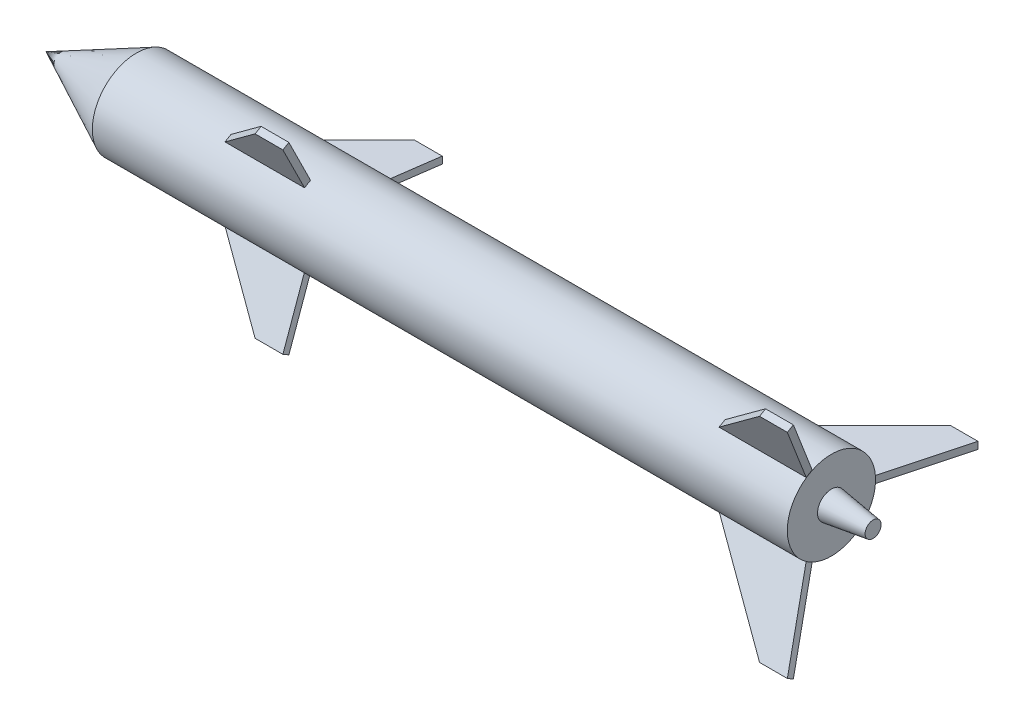
ISO-10303-21;
HEADER;
FILE_DESCRIPTION(('STEP AP214'),'2;1');
FILE_NAME('part.step','',(''),(''),'','','');
FILE_SCHEMA(('AUTOMOTIVE_DESIGN { 1 0 10303 214 1 1 1 1 }'));
ENDSEC;
DATA;
#1=APPLICATION_CONTEXT('core data for automotive mechanical design processes');
#2=APPLICATION_PROTOCOL_DEFINITION('international standard','automotive_design',2000,#1);
#3=PRODUCT_CONTEXT('',#1,'mechanical');
#4=PRODUCT('Part','Part','',(#3));
#5=PRODUCT_RELATED_PRODUCT_CATEGORY('part','',(#4));
#6=PRODUCT_DEFINITION_FORMATION('','',#4);
#7=PRODUCT_DEFINITION_CONTEXT('part definition',#1,'design');
#8=PRODUCT_DEFINITION('design','',#6,#7);
#9=PRODUCT_DEFINITION_SHAPE('','',#8);
#10=(LENGTH_UNIT() NAMED_UNIT(*) SI_UNIT(.MILLI.,.METRE.));
#11=(NAMED_UNIT(*) PLANE_ANGLE_UNIT() SI_UNIT($,.RADIAN.));
#12=(NAMED_UNIT(*) SI_UNIT($,.STERADIAN.) SOLID_ANGLE_UNIT());
#13=UNCERTAINTY_MEASURE_WITH_UNIT(LENGTH_MEASURE(1.E-05),#10,'distance_accuracy_value','');
#14=(GEOMETRIC_REPRESENTATION_CONTEXT(3) GLOBAL_UNCERTAINTY_ASSIGNED_CONTEXT((#13)) GLOBAL_UNIT_ASSIGNED_CONTEXT((#10,
#11,#12)) REPRESENTATION_CONTEXT('',''));
#15=CARTESIAN_POINT('',(0.,0.,0.));
#16=DIRECTION('',(0.,0.,1.));
#17=DIRECTION('',(1.,0.,0.));
#18=AXIS2_PLACEMENT_3D('',#15,#16,#17);
#19=CARTESIAN_POINT('',(226.038858788057,12.7,0.));
#20=DIRECTION('',(-1.,0.,0.));
#21=DIRECTION('',(0.,0.,1.));
#22=AXIS2_PLACEMENT_3D('',#19,#20,#21);
#23=PLANE('',#22);
#24=CARTESIAN_POINT('',(226.038858788057,0.,0.));
#25=DIRECTION('',(-1.,0.,0.));
#26=DIRECTION('',(0.,0.,1.));
#27=AXIS2_PLACEMENT_3D('',#24,#25,#26);
#28=CIRCLE('',#27,12.7);
#29=CARTESIAN_POINT('',(226.038858788057,0.,12.7));
#30=VERTEX_POINT('',#29);
#31=EDGE_CURVE('E445',#30,#30,#28,.T.);
#32=ORIENTED_EDGE('',*,*,#31,.F.);
#33=EDGE_LOOP('',(#32));
#34=FACE_BOUND('',#33,.T.);
#35=CARTESIAN_POINT('',(226.038858788057,0.,0.));
#36=DIRECTION('',(-1.,0.,0.));
#37=DIRECTION('',(0.,0.,1.));
#38=AXIS2_PLACEMENT_3D('',#35,#36,#37);
#39=CIRCLE('',#38,4.);
#40=CARTESIAN_POINT('',(226.038858788057,0.,4.));
#41=VERTEX_POINT('',#40);
#42=EDGE_CURVE('E11',#41,#41,#39,.F.);
#43=ORIENTED_EDGE('',*,*,#42,.F.);
#44=EDGE_LOOP('',(#43));
#45=FACE_BOUND('',#44,.T.);
#46=ADVANCED_FACE('F39',(#34,#45),#23,.F.);
#47=CARTESIAN_POINT('',(-90.3495091606731,0.,0.));
#48=DIRECTION('',(-1.,0.,0.));
#49=DIRECTION('',(0.,0.,1.));
#50=AXIS2_PLACEMENT_3D('',#47,#48,#49);
#51=CYLINDRICAL_SURFACE('',#50,12.7);
#52=CARTESIAN_POINT('',(46.038858788057,0.,0.));
#53=DIRECTION('',(0.707106781186546,0.612372435695794,-0.353553390593277));
#54=DIRECTION('',(-0.707106781186549,0.612372435695792,-0.353553390593276));
#55=AXIS2_PLACEMENT_3D('',#52,#53,#54);
#56=ELLIPSE('',#55,17.9605122421383,12.7);
#57=CARTESIAN_POINT('',(58.6994274956626,-10.4643741271447,7.19630975758725));
#58=VERTEX_POINT('',#57);
#59=CARTESIAN_POINT('',(58.6994274956626,-11.4643741271447,5.46425895001838));
#60=VERTEX_POINT('',#59);
#61=EDGE_CURVE('E293',#58,#60,#56,.T.);
#62=ORIENTED_EDGE('',*,*,#61,.F.);
#63=DIRECTION('',(-1.,0.,0.));
#64=VECTOR('',#63,1.);
#65=CARTESIAN_POINT('',(-90.3495091606731,-10.4643741271447,7.19630975758725));
#66=LINE('',#65,#64);
#67=CARTESIAN_POINT('',(81.6019606409593,-10.4643741271447,7.19630975758725));
#68=VERTEX_POINT('',#67);
#69=EDGE_CURVE('E254',#58,#68,#66,.F.);
#70=ORIENTED_EDGE('',*,*,#69,.T.);
#71=CARTESIAN_POINT('',(79.8226337469855,0.,0.));
#72=DIRECTION('',(-0.990268068741571,-0.120527440954867,0.0695865504800298));
#73=DIRECTION('',(-0.139173100960058,0.857597304086753,-0.49513403437079));
#74=AXIS2_PLACEMENT_3D('',#71,#72,#73);
#75=ELLIPSE('',#74,12.8248101709864,12.7);
#76=CARTESIAN_POINT('',(81.6019606409593,-11.4643741271447,5.46425895001837));
#77=VERTEX_POINT('',#76);
#78=EDGE_CURVE('E63',#77,#68,#75,.T.);
#79=ORIENTED_EDGE('',*,*,#78,.F.);
#80=DIRECTION('',(-1.,0.,0.));
#81=VECTOR('',#80,1.);
#82=CARTESIAN_POINT('',(-90.3495091606731,-11.4643741271447,5.46425895001837));
#83=LINE('',#82,#81);
#84=EDGE_CURVE('E289',#60,#77,#83,.F.);
#85=ORIENTED_EDGE('',*,*,#84,.F.);
#86=EDGE_LOOP('',(#62,#70,#79,#85));
#87=FACE_BOUND('',#86,.T.);
#88=CARTESIAN_POINT('',(222.578858788057,0.,0.));
#89=DIRECTION('',(-0.965925826289068,-0.224143868042013,0.129409522551262));
#90=DIRECTION('',(-0.258819045102521,0.836516303737806,-0.482962913144538));
#91=AXIS2_PLACEMENT_3D('',#88,#89,#90);
#92=ELLIPSE('',#91,13.1480074912081,12.7);
#93=CARTESIAN_POINT('',(225.971247948979,-11.4643741271447,5.46425895001837));
#94=VERTEX_POINT('',#93);
#95=CARTESIAN_POINT('',(225.971247948979,-10.4643741271447,7.19630975758725));
#96=VERTEX_POINT('',#95);
#97=EDGE_CURVE('E385',#94,#96,#92,.T.);
#98=ORIENTED_EDGE('',*,*,#97,.F.);
#99=DIRECTION('',(-1.,0.,0.));
#100=VECTOR('',#99,1.);
#101=CARTESIAN_POINT('',(-90.3495091606731,-11.4643741271447,5.46425895001837));
#102=LINE('',#101,#100);
#103=CARTESIAN_POINT('',(200.885598423183,-11.4643741271447,5.46425895001838));
#104=VERTEX_POINT('',#103);
#105=EDGE_CURVE('E378',#94,#104,#102,.T.);
#106=ORIENTED_EDGE('',*,*,#105,.T.);
#107=CARTESIAN_POINT('',(188.225029715578,0.,0.));
#108=DIRECTION('',(0.707106781186552,0.612372435695789,-0.353553390593275));
#109=DIRECTION('',(-0.707106781186543,0.612372435695796,-0.353553390593279));
#110=AXIS2_PLACEMENT_3D('',#107,#108,#109);
#111=ELLIPSE('',#110,17.9605122421382,12.7);
#112=CARTESIAN_POINT('',(200.885598423183,-10.4643741271447,7.19630975758725));
#113=VERTEX_POINT('',#112);
#114=EDGE_CURVE('E370',#113,#104,#111,.T.);
#115=ORIENTED_EDGE('',*,*,#114,.F.);
#116=DIRECTION('',(-1.,0.,0.));
#117=VECTOR('',#116,1.);
#118=CARTESIAN_POINT('',(-90.3495091606731,-10.4643741271447,7.19630975758725));
#119=LINE('',#118,#117);
#120=EDGE_CURVE('E343',#96,#113,#119,.T.);
#121=ORIENTED_EDGE('',*,*,#120,.F.);
#122=EDGE_LOOP('',(#98,#106,#115,#121));
#123=FACE_BOUND('',#122,.T.);
#124=ORIENTED_EDGE('',*,*,#31,.T.);
#125=EDGE_LOOP('',(#124));
#126=FACE_BOUND('',#125,.T.);
#127=CARTESIAN_POINT('',(26.038858788057,0.,0.));
#128=DIRECTION('',(-1.,0.,0.));
#129=DIRECTION('',(0.,0.,1.));
#130=AXIS2_PLACEMENT_3D('',#127,#128,#129);
#131=CIRCLE('',#130,12.7);
#132=CARTESIAN_POINT('',(26.038858788057,0.,12.7));
#133=VERTEX_POINT('',#132);
#134=EDGE_CURVE('E449',#133,#133,#131,.T.);
#135=ORIENTED_EDGE('',*,*,#134,.F.);
#136=EDGE_LOOP('',(#135));
#137=FACE_BOUND('',#136,.T.);
#138=CARTESIAN_POINT('',(222.578858788057,0.,0.));
#139=DIRECTION('',(-0.965925826289068,0.,-0.258819045102521));
#140=DIRECTION('',(-0.258819045102521,0.,0.965925826289068));
#141=AXIS2_PLACEMENT_3D('',#138,#139,#140);
#142=ELLIPSE('',#141,13.1480074912081,12.7);
#143=CARTESIAN_POINT('',(225.971247948979,1.,-12.6605687076055));
#144=VERTEX_POINT('',#143);
#145=CARTESIAN_POINT('',(225.971247948979,-1.,-12.6605687076055));
#146=VERTEX_POINT('',#145);
#147=EDGE_CURVE('E461',#144,#146,#142,.T.);
#148=ORIENTED_EDGE('',*,*,#147,.F.);
#149=DIRECTION('',(-1.,0.,0.));
#150=VECTOR('',#149,1.);
#151=CARTESIAN_POINT('',(-90.3495091606731,1.,-12.6605687076055));
#152=LINE('',#151,#150);
#153=CARTESIAN_POINT('',(200.885598423183,1.,-12.6605687076055));
#154=VERTEX_POINT('',#153);
#155=EDGE_CURVE('E465',#144,#154,#152,.T.);
#156=ORIENTED_EDGE('',*,*,#155,.T.);
#157=CARTESIAN_POINT('',(188.225029715578,0.,0.));
#158=DIRECTION('',(0.707106781186552,0.,0.707106781186543));
#159=DIRECTION('',(-0.707106781186543,0.,0.707106781186552));
#160=AXIS2_PLACEMENT_3D('',#157,#158,#159);
#161=ELLIPSE('',#160,17.9605122421382,12.7);
#162=CARTESIAN_POINT('',(200.885598423183,-1.,-12.6605687076055));
#163=VERTEX_POINT('',#162);
#164=EDGE_CURVE('E457',#163,#154,#161,.T.);
#165=ORIENTED_EDGE('',*,*,#164,.F.);
#166=DIRECTION('',(-1.,0.,0.));
#167=VECTOR('',#166,1.);
#168=CARTESIAN_POINT('',(-90.3495091606731,-1.,-12.6605687076055));
#169=LINE('',#168,#167);
#170=EDGE_CURVE('E453',#146,#163,#169,.T.);
#171=ORIENTED_EDGE('',*,*,#170,.F.);
#172=EDGE_LOOP('',(#148,#156,#165,#171));
#173=FACE_BOUND('',#172,.T.);
#174=DIRECTION('',(-1.,0.,0.));
#175=VECTOR('',#174,1.);
#176=CARTESIAN_POINT('',(-90.3495091606731,1.,-12.6605687076055));
#177=LINE('',#176,#175);
#178=CARTESIAN_POINT('',(58.6994274956626,1.,-12.6605687076055));
#179=VERTEX_POINT('',#178);
#180=CARTESIAN_POINT('',(81.6019606409593,1.,-12.6605687076055));
#181=VERTEX_POINT('',#180);
#182=EDGE_CURVE('E48',#179,#181,#177,.F.);
#183=ORIENTED_EDGE('',*,*,#182,.F.);
#184=CARTESIAN_POINT('',(46.038858788057,0.,0.));
#185=DIRECTION('',(0.707106781186546,0.,0.707106781186549));
#186=DIRECTION('',(-0.707106781186549,0.,0.707106781186546));
#187=AXIS2_PLACEMENT_3D('',#184,#185,#186);
#188=ELLIPSE('',#187,17.9605122421383,12.7);
#189=CARTESIAN_POINT('',(58.6994274956626,-1.,-12.6605687076055));
#190=VERTEX_POINT('',#189);
#191=EDGE_CURVE('E476',#190,#179,#188,.T.);
#192=ORIENTED_EDGE('',*,*,#191,.F.);
#193=DIRECTION('',(-1.,0.,0.));
#194=VECTOR('',#193,1.);
#195=CARTESIAN_POINT('',(-90.3495091606731,-1.,-12.6605687076055));
#196=LINE('',#195,#194);
#197=CARTESIAN_POINT('',(81.6019606409593,-1.,-12.6605687076055));
#198=VERTEX_POINT('',#197);
#199=EDGE_CURVE('E468',#190,#198,#196,.F.);
#200=ORIENTED_EDGE('',*,*,#199,.T.);
#201=CARTESIAN_POINT('',(79.8226337469855,0.,0.));
#202=DIRECTION('',(-0.990268068741571,0.,-0.139173100960058));
#203=DIRECTION('',(-0.139173100960058,0.,0.990268068741571));
#204=AXIS2_PLACEMENT_3D('',#201,#202,#203);
#205=ELLIPSE('',#204,12.8248101709864,12.7);
#206=EDGE_CURVE('E472',#181,#198,#205,.T.);
#207=ORIENTED_EDGE('',*,*,#206,.F.);
#208=EDGE_LOOP('',(#183,#192,#200,#207));
#209=FACE_BOUND('',#208,.T.);
#210=CARTESIAN_POINT('',(222.578858788057,0.,0.));
#211=DIRECTION('',(-0.965925826289068,0.224143868042015,0.129409522551258));
#212=DIRECTION('',(-0.258819045102521,-0.836516303737812,-0.482962913144526));
#213=AXIS2_PLACEMENT_3D('',#210,#211,#212);
#214=ELLIPSE('',#213,13.1480074912081,12.7);
#215=CARTESIAN_POINT('',(225.971247948979,10.4643741271448,7.1963097575871));
#216=VERTEX_POINT('',#215);
#217=CARTESIAN_POINT('',(225.971247948979,11.4643741271447,5.46425895001821));
#218=VERTEX_POINT('',#217);
#219=EDGE_CURVE('E339',#216,#218,#214,.T.);
#220=ORIENTED_EDGE('',*,*,#219,.F.);
#221=DIRECTION('',(-1.,0.,0.));
#222=VECTOR('',#221,1.);
#223=CARTESIAN_POINT('',(-90.3495091606731,10.4643741271448,7.1963097575871));
#224=LINE('',#223,#222);
#225=CARTESIAN_POINT('',(200.885598423183,10.4643741271448,7.1963097575871));
#226=VERTEX_POINT('',#225);
#227=EDGE_CURVE('E332',#216,#226,#224,.T.);
#228=ORIENTED_EDGE('',*,*,#227,.T.);
#229=CARTESIAN_POINT('',(188.225029715578,0.,0.));
#230=DIRECTION('',(0.707106781186552,-0.612372435695794,-0.353553390593266));
#231=DIRECTION('',(-0.707106781186543,-0.612372435695801,-0.35355339059327));
#232=AXIS2_PLACEMENT_3D('',#229,#230,#231);
#233=ELLIPSE('',#232,17.9605122421382,12.7);
#234=CARTESIAN_POINT('',(200.885598423183,11.4643741271447,5.46425895001821));
#235=VERTEX_POINT('',#234);
#236=EDGE_CURVE('E324',#235,#226,#233,.T.);
#237=ORIENTED_EDGE('',*,*,#236,.F.);
#238=DIRECTION('',(-1.,0.,0.));
#239=VECTOR('',#238,1.);
#240=CARTESIAN_POINT('',(-90.3495091606731,11.4643741271447,5.46425895001821));
#241=LINE('',#240,#239);
#242=EDGE_CURVE('E297',#218,#235,#241,.T.);
#243=ORIENTED_EDGE('',*,*,#242,.F.);
#244=EDGE_LOOP('',(#220,#228,#237,#243));
#245=FACE_BOUND('',#244,.T.);
#246=CARTESIAN_POINT('',(46.038858788057,0.,0.));
#247=DIRECTION('',(0.707106781186546,-0.612372435695799,-0.353553390593269));
#248=DIRECTION('',(-0.707106781186549,-0.612372435695797,-0.353553390593267));
#249=AXIS2_PLACEMENT_3D('',#246,#247,#248);
#250=ELLIPSE('',#249,17.9605122421383,12.7);
#251=CARTESIAN_POINT('',(58.6994274956626,11.4643741271447,5.46425895001821));
#252=VERTEX_POINT('',#251);
#253=CARTESIAN_POINT('',(58.6994274956626,10.4643741271448,7.1963097575871));
#254=VERTEX_POINT('',#253);
#255=EDGE_CURVE('E251',#252,#254,#250,.T.);
#256=ORIENTED_EDGE('',*,*,#255,.F.);
#257=DIRECTION('',(-1.,0.,0.));
#258=VECTOR('',#257,1.);
#259=CARTESIAN_POINT('',(-90.3495091606731,11.4643741271447,5.46425895001821));
#260=LINE('',#259,#258);
#261=CARTESIAN_POINT('',(81.6019606409593,11.4643741271447,5.46425895001821));
#262=VERTEX_POINT('',#261);
#263=EDGE_CURVE('E215',#252,#262,#260,.F.);
#264=ORIENTED_EDGE('',*,*,#263,.T.);
#265=CARTESIAN_POINT('',(79.8226337469855,0.,0.));
#266=DIRECTION('',(-0.990268068741571,0.120527440954868,0.0695865504800281));
#267=DIRECTION('',(-0.139173100960058,-0.85759730408676,-0.495134034370778));
#268=AXIS2_PLACEMENT_3D('',#265,#266,#267);
#269=ELLIPSE('',#268,12.8248101709864,12.7);
#270=CARTESIAN_POINT('',(81.6019606409593,10.4643741271448,7.1963097575871));
#271=VERTEX_POINT('',#270);
#272=EDGE_CURVE('E55',#271,#262,#269,.T.);
#273=ORIENTED_EDGE('',*,*,#272,.F.);
#274=DIRECTION('',(-1.,0.,0.));
#275=VECTOR('',#274,1.);
#276=CARTESIAN_POINT('',(-90.3495091606731,10.4643741271448,7.1963097575871));
#277=LINE('',#276,#275);
#278=EDGE_CURVE('E247',#254,#271,#277,.F.);
#279=ORIENTED_EDGE('',*,*,#278,.F.);
#280=EDGE_LOOP('',(#256,#264,#273,#279));
#281=FACE_BOUND('',#280,.T.);
#282=ADVANCED_FACE('F491',(#87,#123,#126,#137,#173,#209,#245,#281),#51,.T.);
#283=CARTESIAN_POINT('',(26.038858788057,0.,0.));
#284=DIRECTION('',(1.,0.,0.));
#285=DIRECTION('',(0.,0.,-1.));
#286=AXIS2_PLACEMENT_3D('',#283,#284,#285);
#287=CONICAL_SURFACE('',#286,12.7,0.453785605518527);
#288=CARTESIAN_POINT('',(0.,0.,0.));
#289=VERTEX_POINT('',#288);
#290=VERTEX_LOOP('',#289);
#291=FACE_BOUND('',#290,.T.);
#292=ORIENTED_EDGE('',*,*,#134,.T.);
#293=EDGE_LOOP('',(#292));
#294=FACE_BOUND('',#293,.T.);
#295=ADVANCED_FACE('F41',(#291,#294),#287,.T.);
#296=CARTESIAN_POINT('',(222.578858788057,1.,0.));
#297=DIRECTION('',(-0.965925826289068,0.,-0.258819045102521));
#298=DIRECTION('',(-0.258819045102521,0.,0.965925826289068));
#299=AXIS2_PLACEMENT_3D('',#296,#297,#298);
#300=PLANE('',#299);
#301=DIRECTION('',(0.258819045102521,0.,-0.965925826289068));
#302=VECTOR('',#301,1.);
#303=CARTESIAN_POINT('',(222.578858788057,1.,0.));
#304=LINE('',#303,#302);
#305=CARTESIAN_POINT('',(232.225029715577,1.,-36.));
#306=VERTEX_POINT('',#305);
#307=EDGE_CURVE('E418',#144,#306,#304,.T.);
#308=ORIENTED_EDGE('',*,*,#307,.F.);
#309=ORIENTED_EDGE('',*,*,#147,.T.);
#310=DIRECTION('',(0.258819045102521,0.,-0.965925826289068));
#311=VECTOR('',#310,1.);
#312=CARTESIAN_POINT('',(222.578858788057,-1.,0.));
#313=LINE('',#312,#311);
#314=CARTESIAN_POINT('',(232.225029715577,-1.,-36.));
#315=VERTEX_POINT('',#314);
#316=EDGE_CURVE('E417',#146,#315,#313,.T.);
#317=ORIENTED_EDGE('',*,*,#316,.T.);
#318=DIRECTION('',(0.,-1.,0.));
#319=VECTOR('',#318,1.);
#320=CARTESIAN_POINT('',(232.225029715577,1.,-36.));
#321=LINE('',#320,#319);
#322=EDGE_CURVE('E441',#306,#315,#321,.T.);
#323=ORIENTED_EDGE('',*,*,#322,.F.);
#324=EDGE_LOOP('',(#308,#309,#317,#323));
#325=FACE_BOUND('',#324,.T.);
#326=ADVANCED_FACE('F524',(#325),#300,.F.);
#327=CARTESIAN_POINT('',(224.225029715577,1.,-36.));
#328=DIRECTION('',(0.707106781186552,0.,0.707106781186543));
#329=DIRECTION('',(0.707106781186543,0.,-0.707106781186552));
#330=AXIS2_PLACEMENT_3D('',#327,#328,#329);
#331=PLANE('',#330);
#332=DIRECTION('',(-0.707106781186543,0.,0.707106781186551));
#333=VECTOR('',#332,1.);
#334=CARTESIAN_POINT('',(224.225029715577,-1.,-36.));
#335=LINE('',#334,#333);
#336=CARTESIAN_POINT('',(224.225029715577,-1.,-36.));
#337=VERTEX_POINT('',#336);
#338=EDGE_CURVE('E422',#337,#163,#335,.T.);
#339=ORIENTED_EDGE('',*,*,#338,.T.);
#340=ORIENTED_EDGE('',*,*,#164,.T.);
#341=DIRECTION('',(-0.707106781186543,0.,0.707106781186551));
#342=VECTOR('',#341,1.);
#343=CARTESIAN_POINT('',(224.225029715577,1.,-36.));
#344=LINE('',#343,#342);
#345=CARTESIAN_POINT('',(224.225029715577,1.,-36.));
#346=VERTEX_POINT('',#345);
#347=EDGE_CURVE('E425',#346,#154,#344,.T.);
#348=ORIENTED_EDGE('',*,*,#347,.F.);
#349=DIRECTION('',(0.,-1.,0.));
#350=VECTOR('',#349,1.);
#351=CARTESIAN_POINT('',(224.225029715577,1.,-36.));
#352=LINE('',#351,#350);
#353=EDGE_CURVE('E429',#346,#337,#352,.T.);
#354=ORIENTED_EDGE('',*,*,#353,.T.);
#355=EDGE_LOOP('',(#339,#340,#348,#354));
#356=FACE_BOUND('',#355,.T.);
#357=ADVANCED_FACE('F527',(#356),#331,.F.);
#358=CARTESIAN_POINT('',(222.578858788057,1.,0.));
#359=DIRECTION('',(0.,1.,0.));
#360=DIRECTION('',(0.,0.,1.));
#361=AXIS2_PLACEMENT_3D('',#358,#359,#360);
#362=PLANE('',#361);
#363=ORIENTED_EDGE('',*,*,#155,.F.);
#364=ORIENTED_EDGE('',*,*,#307,.T.);
#365=DIRECTION('',(-1.,0.,0.));
#366=VECTOR('',#365,1.);
#367=CARTESIAN_POINT('',(232.225029715577,1.,-36.));
#368=LINE('',#367,#366);
#369=EDGE_CURVE('E421',#306,#346,#368,.T.);
#370=ORIENTED_EDGE('',*,*,#369,.T.);
#371=ORIENTED_EDGE('',*,*,#347,.T.);
#372=EDGE_LOOP('',(#363,#364,#370,#371));
#373=FACE_BOUND('',#372,.T.);
#374=ADVANCED_FACE('F536',(#373),#362,.T.);
#375=CARTESIAN_POINT('',(222.578858788057,-1.,0.));
#376=DIRECTION('',(0.,1.,0.));
#377=DIRECTION('',(0.,0.,1.));
#378=AXIS2_PLACEMENT_3D('',#375,#376,#377);
#379=PLANE('',#378);
#380=ORIENTED_EDGE('',*,*,#316,.F.);
#381=ORIENTED_EDGE('',*,*,#170,.T.);
#382=ORIENTED_EDGE('',*,*,#338,.F.);
#383=DIRECTION('',(-1.,0.,0.));
#384=VECTOR('',#383,1.);
#385=CARTESIAN_POINT('',(232.225029715577,-1.,-36.));
#386=LINE('',#385,#384);
#387=EDGE_CURVE('E432',#315,#337,#386,.T.);
#388=ORIENTED_EDGE('',*,*,#387,.F.);
#389=EDGE_LOOP('',(#380,#381,#382,#388));
#390=FACE_BOUND('',#389,.T.);
#391=ADVANCED_FACE('F532',(#390),#379,.F.);
#392=CARTESIAN_POINT('',(232.225029715577,1.,-36.));
#393=DIRECTION('',(0.,0.,1.));
#394=DIRECTION('',(1.,0.,0.));
#395=AXIS2_PLACEMENT_3D('',#392,#393,#394);
#396=PLANE('',#395);
#397=ORIENTED_EDGE('',*,*,#387,.T.);
#398=ORIENTED_EDGE('',*,*,#353,.F.);
#399=ORIENTED_EDGE('',*,*,#369,.F.);
#400=ORIENTED_EDGE('',*,*,#322,.T.);
#401=EDGE_LOOP('',(#397,#398,#399,#400));
#402=FACE_BOUND('',#401,.T.);
#403=ADVANCED_FACE('F529',(#402),#396,.F.);
#404=CARTESIAN_POINT('',(46.038858788057,1.,0.));
#405=DIRECTION('',(0.707106781186546,0.,0.707106781186549));
#406=DIRECTION('',(0.707106781186549,0.,-0.707106781186546));
#407=AXIS2_PLACEMENT_3D('',#404,#405,#406);
#408=PLANE('',#407);
#409=DIRECTION('',(-0.707106781186549,0.,0.707106781186546));
#410=VECTOR('',#409,1.);
#411=CARTESIAN_POINT('',(46.038858788057,-1.,0.));
#412=LINE('',#411,#410);
#413=CARTESIAN_POINT('',(76.0388587880571,-1.,-30.));
#414=VERTEX_POINT('',#413);
#415=EDGE_CURVE('E389',#414,#190,#412,.T.);
#416=ORIENTED_EDGE('',*,*,#415,.T.);
#417=ORIENTED_EDGE('',*,*,#191,.T.);
#418=DIRECTION('',(-0.707106781186549,0.,0.707106781186546));
#419=VECTOR('',#418,1.);
#420=CARTESIAN_POINT('',(46.038858788057,1.,0.));
#421=LINE('',#420,#419);
#422=CARTESIAN_POINT('',(76.0388587880571,1.,-30.));
#423=VERTEX_POINT('',#422);
#424=EDGE_CURVE('E390',#423,#179,#421,.T.);
#425=ORIENTED_EDGE('',*,*,#424,.F.);
#426=DIRECTION('',(0.,-1.,0.));
#427=VECTOR('',#426,1.);
#428=CARTESIAN_POINT('',(76.0388587880571,1.,-30.));
#429=LINE('',#428,#427);
#430=EDGE_CURVE('E401',#423,#414,#429,.T.);
#431=ORIENTED_EDGE('',*,*,#430,.T.);
#432=EDGE_LOOP('',(#416,#417,#425,#431));
#433=FACE_BOUND('',#432,.T.);
#434=ADVANCED_FACE('F498',(#433),#408,.F.);
#435=CARTESIAN_POINT('',(84.0388587880571,1.,-30.));
#436=DIRECTION('',(-0.990268068741571,0.,-0.139173100960058));
#437=DIRECTION('',(-0.139173100960058,0.,0.990268068741571));
#438=AXIS2_PLACEMENT_3D('',#435,#436,#437);
#439=PLANE('',#438);
#440=DIRECTION('',(0.139173100960058,0.,-0.990268068741571));
#441=VECTOR('',#440,1.);
#442=CARTESIAN_POINT('',(84.0388587880571,1.,-30.));
#443=LINE('',#442,#441);
#444=CARTESIAN_POINT('',(84.0388587880571,1.,-30.));
#445=VERTEX_POINT('',#444);
#446=EDGE_CURVE('E394',#181,#445,#443,.T.);
#447=ORIENTED_EDGE('',*,*,#446,.F.);
#448=ORIENTED_EDGE('',*,*,#206,.T.);
#449=DIRECTION('',(0.139173100960058,0.,-0.990268068741571));
#450=VECTOR('',#449,1.);
#451=CARTESIAN_POINT('',(84.0388587880571,-1.,-30.));
#452=LINE('',#451,#450);
#453=CARTESIAN_POINT('',(84.0388587880571,-1.,-30.));
#454=VERTEX_POINT('',#453);
#455=EDGE_CURVE('E405',#198,#454,#452,.T.);
#456=ORIENTED_EDGE('',*,*,#455,.T.);
#457=DIRECTION('',(0.,-1.,0.));
#458=VECTOR('',#457,1.);
#459=CARTESIAN_POINT('',(84.0388587880571,1.,-30.));
#460=LINE('',#459,#458);
#461=EDGE_CURVE('E413',#445,#454,#460,.T.);
#462=ORIENTED_EDGE('',*,*,#461,.F.);
#463=EDGE_LOOP('',(#447,#448,#456,#462));
#464=FACE_BOUND('',#463,.T.);
#465=ADVANCED_FACE('F489',(#464),#439,.F.);
#466=CARTESIAN_POINT('',(76.0388587880571,1.,-30.));
#467=DIRECTION('',(0.,-1.,0.));
#468=DIRECTION('',(0.,0.,-1.));
#469=AXIS2_PLACEMENT_3D('',#466,#467,#468);
#470=PLANE('',#469);
#471=ORIENTED_EDGE('',*,*,#424,.T.);
#472=ORIENTED_EDGE('',*,*,#182,.T.);
#473=ORIENTED_EDGE('',*,*,#446,.T.);
#474=DIRECTION('',(-1.,0.,0.));
#475=VECTOR('',#474,1.);
#476=CARTESIAN_POINT('',(76.0388587880571,1.,-30.));
#477=LINE('',#476,#475);
#478=EDGE_CURVE('E398',#445,#423,#477,.T.);
#479=ORIENTED_EDGE('',*,*,#478,.T.);
#480=EDGE_LOOP('',(#471,#472,#473,#479));
#481=FACE_BOUND('',#480,.T.);
#482=ADVANCED_FACE('F482',(#481),#470,.F.);
#483=CARTESIAN_POINT('',(76.0388587880571,-1.,-30.));
#484=DIRECTION('',(0.,-1.,0.));
#485=DIRECTION('',(0.,0.,-1.));
#486=AXIS2_PLACEMENT_3D('',#483,#484,#485);
#487=PLANE('',#486);
#488=ORIENTED_EDGE('',*,*,#199,.F.);
#489=ORIENTED_EDGE('',*,*,#415,.F.);
#490=DIRECTION('',(-1.,0.,0.));
#491=VECTOR('',#490,1.);
#492=CARTESIAN_POINT('',(76.0388587880571,-1.,-30.));
#493=LINE('',#492,#491);
#494=EDGE_CURVE('E395',#454,#414,#493,.T.);
#495=ORIENTED_EDGE('',*,*,#494,.F.);
#496=ORIENTED_EDGE('',*,*,#455,.F.);
#497=EDGE_LOOP('',(#488,#489,#495,#496));
#498=FACE_BOUND('',#497,.T.);
#499=ADVANCED_FACE('F495',(#498),#487,.T.);
#500=CARTESIAN_POINT('',(76.0388587880571,1.,-30.));
#501=DIRECTION('',(0.,0.,1.));
#502=DIRECTION('',(1.,0.,0.));
#503=AXIS2_PLACEMENT_3D('',#500,#501,#502);
#504=PLANE('',#503);
#505=ORIENTED_EDGE('',*,*,#494,.T.);
#506=ORIENTED_EDGE('',*,*,#430,.F.);
#507=ORIENTED_EDGE('',*,*,#478,.F.);
#508=ORIENTED_EDGE('',*,*,#461,.T.);
#509=EDGE_LOOP('',(#505,#506,#507,#508));
#510=FACE_BOUND('',#509,.T.);
#511=ADVANCED_FACE('F501',(#510),#504,.F.);
#512=CARTESIAN_POINT('',(222.578858788057,-0.500000000000004,-0.866025403784436));
#513=DIRECTION('',(-0.965925826289068,-0.224143868042013,0.129409522551262));
#514=DIRECTION('',(-0.258819045102521,0.836516303737806,-0.482962913144538));
#515=AXIS2_PLACEMENT_3D('',#512,#513,#514);
#516=PLANE('',#515);
#517=DIRECTION('',(0.258819045102521,-0.836516303737806,0.482962913144538));
#518=VECTOR('',#517,1.);
#519=CARTESIAN_POINT('',(222.578858788057,-0.500000000000004,-0.866025403784436));
#520=LINE('',#519,#518);
#521=CARTESIAN_POINT('',(232.225029715577,-31.6769145362397,17.1339745962157));
#522=VERTEX_POINT('',#521);
#523=EDGE_CURVE('E381',#94,#522,#520,.T.);
#524=ORIENTED_EDGE('',*,*,#523,.F.);
#525=ORIENTED_EDGE('',*,*,#97,.T.);
#526=DIRECTION('',(0.258819045102521,-0.836516303737806,0.482962913144538));
#527=VECTOR('',#526,1.);
#528=CARTESIAN_POINT('',(222.578858788057,0.500000000000004,0.866025403784436));
#529=LINE('',#528,#527);
#530=CARTESIAN_POINT('',(232.225029715577,-30.6769145362397,18.8660254037846));
#531=VERTEX_POINT('',#530);
#532=EDGE_CURVE('E362',#96,#531,#529,.T.);
#533=ORIENTED_EDGE('',*,*,#532,.T.);
#534=DIRECTION('',(0.,0.500000000000004,0.866025403784436));
#535=VECTOR('',#534,1.);
#536=CARTESIAN_POINT('',(232.225029715577,-31.6769145362397,17.1339745962157));
#537=LINE('',#536,#535);
#538=EDGE_CURVE('E358',#522,#531,#537,.T.);
#539=ORIENTED_EDGE('',*,*,#538,.F.);
#540=EDGE_LOOP('',(#524,#525,#533,#539));
#541=FACE_BOUND('',#540,.T.);
#542=ADVANCED_FACE('F503',(#541),#516,.F.);
#543=CARTESIAN_POINT('',(222.578858788057,-0.500000000000004,-0.866025403784436));
#544=DIRECTION('',(0.,-0.500000000000004,-0.866025403784436));
#545=DIRECTION('',(0.,0.866025403784436,-0.500000000000004));
#546=AXIS2_PLACEMENT_3D('',#543,#544,#545);
#547=PLANE('',#546);
#548=ORIENTED_EDGE('',*,*,#105,.F.);
#549=ORIENTED_EDGE('',*,*,#523,.T.);
#550=DIRECTION('',(-1.,0.,0.));
#551=VECTOR('',#550,1.);
#552=CARTESIAN_POINT('',(232.225029715577,-31.6769145362397,17.1339745962157));
#553=LINE('',#552,#551);
#554=CARTESIAN_POINT('',(224.225029715577,-31.6769145362397,17.1339745962157));
#555=VERTEX_POINT('',#554);
#556=EDGE_CURVE('E354',#522,#555,#553,.T.);
#557=ORIENTED_EDGE('',*,*,#556,.T.);
#558=DIRECTION('',(-0.707106781186543,0.612372435695796,-0.353553390593279));
#559=VECTOR('',#558,1.);
#560=CARTESIAN_POINT('',(224.225029715577,-31.6769145362397,17.1339745962157));
#561=LINE('',#560,#559);
#562=EDGE_CURVE('E374',#555,#104,#561,.T.);
#563=ORIENTED_EDGE('',*,*,#562,.T.);
#564=EDGE_LOOP('',(#548,#549,#557,#563));
#565=FACE_BOUND('',#564,.T.);
#566=ADVANCED_FACE('F509',(#565),#547,.T.);
#567=CARTESIAN_POINT('',(224.225029715577,-31.6769145362397,17.1339745962157));
#568=DIRECTION('',(0.707106781186552,0.612372435695789,-0.353553390593275));
#569=DIRECTION('',(0.707106781186543,-0.612372435695796,0.353553390593279));
#570=AXIS2_PLACEMENT_3D('',#567,#568,#569);
#571=PLANE('',#570);
#572=DIRECTION('',(-0.707106781186543,0.612372435695796,-0.353553390593279));
#573=VECTOR('',#572,1.);
#574=CARTESIAN_POINT('',(224.225029715577,-30.6769145362397,18.8660254037846));
#575=LINE('',#574,#573);
#576=CARTESIAN_POINT('',(224.225029715577,-30.6769145362397,18.8660254037846));
#577=VERTEX_POINT('',#576);
#578=EDGE_CURVE('E366',#577,#113,#575,.T.);
#579=ORIENTED_EDGE('',*,*,#578,.T.);
#580=ORIENTED_EDGE('',*,*,#114,.T.);
#581=ORIENTED_EDGE('',*,*,#562,.F.);
#582=DIRECTION('',(0.,0.500000000000004,0.866025403784436));
#583=VECTOR('',#582,1.);
#584=CARTESIAN_POINT('',(224.225029715577,-31.6769145362397,17.1339745962157));
#585=LINE('',#584,#583);
#586=EDGE_CURVE('E350',#555,#577,#585,.T.);
#587=ORIENTED_EDGE('',*,*,#586,.T.);
#588=EDGE_LOOP('',(#579,#580,#581,#587));
#589=FACE_BOUND('',#588,.T.);
#590=ADVANCED_FACE('F555',(#589),#571,.F.);
#591=CARTESIAN_POINT('',(222.578858788057,0.500000000000004,0.866025403784436));
#592=DIRECTION('',(0.,-0.500000000000004,-0.866025403784436));
#593=DIRECTION('',(0.,0.866025403784436,-0.500000000000004));
#594=AXIS2_PLACEMENT_3D('',#591,#592,#593);
#595=PLANE('',#594);
#596=ORIENTED_EDGE('',*,*,#532,.F.);
#597=ORIENTED_EDGE('',*,*,#120,.T.);
#598=ORIENTED_EDGE('',*,*,#578,.F.);
#599=DIRECTION('',(-1.,0.,0.));
#600=VECTOR('',#599,1.);
#601=CARTESIAN_POINT('',(232.225029715577,-30.6769145362397,18.8660254037846));
#602=LINE('',#601,#600);
#603=EDGE_CURVE('E347',#531,#577,#602,.T.);
#604=ORIENTED_EDGE('',*,*,#603,.F.);
#605=EDGE_LOOP('',(#596,#597,#598,#604));
#606=FACE_BOUND('',#605,.T.);
#607=ADVANCED_FACE('F559',(#606),#595,.F.);
#608=CARTESIAN_POINT('',(232.225029715577,-31.6769145362397,17.1339745962157));
#609=DIRECTION('',(0.,0.866025403784436,-0.500000000000004));
#610=DIRECTION('',(1.,0.,0.));
#611=AXIS2_PLACEMENT_3D('',#608,#609,#610);
#612=PLANE('',#611);
#613=ORIENTED_EDGE('',*,*,#603,.T.);
#614=ORIENTED_EDGE('',*,*,#586,.F.);
#615=ORIENTED_EDGE('',*,*,#556,.F.);
#616=ORIENTED_EDGE('',*,*,#538,.T.);
#617=EDGE_LOOP('',(#613,#614,#615,#616));
#618=FACE_BOUND('',#617,.T.);
#619=ADVANCED_FACE('F563',(#618),#612,.F.);
#620=CARTESIAN_POINT('',(222.578858788057,-0.499999999999992,0.866025403784443));
#621=DIRECTION('',(-0.965925826289068,0.224143868042015,0.129409522551258));
#622=DIRECTION('',(-0.258819045102521,-0.836516303737812,-0.482962913144526));
#623=AXIS2_PLACEMENT_3D('',#620,#621,#622);
#624=PLANE('',#623);
#625=DIRECTION('',(0.258819045102521,0.836516303737812,0.482962913144526));
#626=VECTOR('',#625,1.);
#627=CARTESIAN_POINT('',(222.578858788057,-0.499999999999992,0.866025403784443));
#628=LINE('',#627,#626);
#629=CARTESIAN_POINT('',(232.225029715577,30.67691453624,18.8660254037841));
#630=VERTEX_POINT('',#629);
#631=EDGE_CURVE('E335',#216,#630,#628,.T.);
#632=ORIENTED_EDGE('',*,*,#631,.F.);
#633=ORIENTED_EDGE('',*,*,#219,.T.);
#634=DIRECTION('',(0.258819045102521,0.836516303737812,0.482962913144526));
#635=VECTOR('',#634,1.);
#636=CARTESIAN_POINT('',(222.578858788057,0.499999999999992,-0.866025403784443));
#637=LINE('',#636,#635);
#638=CARTESIAN_POINT('',(232.225029715577,31.6769145362399,17.1339745962153));
#639=VERTEX_POINT('',#638);
#640=EDGE_CURVE('E316',#218,#639,#637,.T.);
#641=ORIENTED_EDGE('',*,*,#640,.T.);
#642=DIRECTION('',(0.,0.499999999999992,-0.866025403784443));
#643=VECTOR('',#642,1.);
#644=CARTESIAN_POINT('',(232.225029715577,30.67691453624,18.8660254037841));
#645=LINE('',#644,#643);
#646=EDGE_CURVE('E312',#630,#639,#645,.T.);
#647=ORIENTED_EDGE('',*,*,#646,.F.);
#648=EDGE_LOOP('',(#632,#633,#641,#647));
#649=FACE_BOUND('',#648,.T.);
#650=ADVANCED_FACE('F567',(#649),#624,.F.);
#651=CARTESIAN_POINT('',(222.578858788057,-0.499999999999992,0.866025403784443));
#652=DIRECTION('',(0.,-0.499999999999992,0.866025403784443));
#653=DIRECTION('',(0.,-0.866025403784443,-0.499999999999992));
#654=AXIS2_PLACEMENT_3D('',#651,#652,#653);
#655=PLANE('',#654);
#656=ORIENTED_EDGE('',*,*,#227,.F.);
#657=ORIENTED_EDGE('',*,*,#631,.T.);
#658=DIRECTION('',(-1.,0.,0.));
#659=VECTOR('',#658,1.);
#660=CARTESIAN_POINT('',(232.225029715577,30.67691453624,18.8660254037841));
#661=LINE('',#660,#659);
#662=CARTESIAN_POINT('',(224.225029715577,30.67691453624,18.8660254037841));
#663=VERTEX_POINT('',#662);
#664=EDGE_CURVE('E308',#630,#663,#661,.T.);
#665=ORIENTED_EDGE('',*,*,#664,.T.);
#666=DIRECTION('',(-0.707106781186543,-0.612372435695801,-0.35355339059327));
#667=VECTOR('',#666,1.);
#668=CARTESIAN_POINT('',(224.225029715577,30.67691453624,18.8660254037841));
#669=LINE('',#668,#667);
#670=EDGE_CURVE('E328',#663,#226,#669,.T.);
#671=ORIENTED_EDGE('',*,*,#670,.T.);
#672=EDGE_LOOP('',(#656,#657,#665,#671));
#673=FACE_BOUND('',#672,.T.);
#674=ADVANCED_FACE('F571',(#673),#655,.T.);
#675=CARTESIAN_POINT('',(224.225029715577,30.67691453624,18.8660254037841));
#676=DIRECTION('',(0.707106781186552,-0.612372435695794,-0.353553390593266));
#677=DIRECTION('',(0.707106781186543,0.612372435695801,0.35355339059327));
#678=AXIS2_PLACEMENT_3D('',#675,#676,#677);
#679=PLANE('',#678);
#680=DIRECTION('',(-0.707106781186543,-0.612372435695801,-0.35355339059327));
#681=VECTOR('',#680,1.);
#682=CARTESIAN_POINT('',(224.225029715577,31.6769145362399,17.1339745962153));
#683=LINE('',#682,#681);
#684=CARTESIAN_POINT('',(224.225029715577,31.6769145362399,17.1339745962153));
#685=VERTEX_POINT('',#684);
#686=EDGE_CURVE('E320',#685,#235,#683,.T.);
#687=ORIENTED_EDGE('',*,*,#686,.T.);
#688=ORIENTED_EDGE('',*,*,#236,.T.);
#689=ORIENTED_EDGE('',*,*,#670,.F.);
#690=DIRECTION('',(0.,0.499999999999992,-0.866025403784443));
#691=VECTOR('',#690,1.);
#692=CARTESIAN_POINT('',(224.225029715577,30.67691453624,18.8660254037841));
#693=LINE('',#692,#691);
#694=EDGE_CURVE('E304',#663,#685,#693,.T.);
#695=ORIENTED_EDGE('',*,*,#694,.T.);
#696=EDGE_LOOP('',(#687,#688,#689,#695));
#697=FACE_BOUND('',#696,.T.);
#698=ADVANCED_FACE('F575',(#697),#679,.F.);
#699=CARTESIAN_POINT('',(222.578858788057,0.499999999999992,-0.866025403784443));
#700=DIRECTION('',(0.,-0.499999999999992,0.866025403784443));
#701=DIRECTION('',(0.,-0.866025403784443,-0.499999999999992));
#702=AXIS2_PLACEMENT_3D('',#699,#700,#701);
#703=PLANE('',#702);
#704=ORIENTED_EDGE('',*,*,#640,.F.);
#705=ORIENTED_EDGE('',*,*,#242,.T.);
#706=ORIENTED_EDGE('',*,*,#686,.F.);
#707=DIRECTION('',(-1.,0.,0.));
#708=VECTOR('',#707,1.);
#709=CARTESIAN_POINT('',(232.225029715577,31.6769145362399,17.1339745962153));
#710=LINE('',#709,#708);
#711=EDGE_CURVE('E301',#639,#685,#710,.T.);
#712=ORIENTED_EDGE('',*,*,#711,.F.);
#713=EDGE_LOOP('',(#704,#705,#706,#712));
#714=FACE_BOUND('',#713,.T.);
#715=ADVANCED_FACE('F579',(#714),#703,.F.);
#716=CARTESIAN_POINT('',(232.225029715577,30.67691453624,18.8660254037841));
#717=DIRECTION('',(0.,-0.866025403784443,-0.499999999999992));
#718=DIRECTION('',(1.,0.,0.));
#719=AXIS2_PLACEMENT_3D('',#716,#717,#718);
#720=PLANE('',#719);
#721=ORIENTED_EDGE('',*,*,#711,.T.);
#722=ORIENTED_EDGE('',*,*,#694,.F.);
#723=ORIENTED_EDGE('',*,*,#664,.F.);
#724=ORIENTED_EDGE('',*,*,#646,.T.);
#725=EDGE_LOOP('',(#721,#722,#723,#724));
#726=FACE_BOUND('',#725,.T.);
#727=ADVANCED_FACE('F583',(#726),#720,.F.);
#728=CARTESIAN_POINT('',(46.038858788057,-0.500000000000004,-0.866025403784436));
#729=DIRECTION('',(0.707106781186546,0.612372435695794,-0.353553390593277));
#730=DIRECTION('',(0.707106781186549,-0.612372435695792,0.353553390593276));
#731=AXIS2_PLACEMENT_3D('',#728,#729,#730);
#732=PLANE('',#731);
#733=DIRECTION('',(-0.707106781186549,0.612372435695792,-0.353553390593276));
#734=VECTOR('',#733,1.);
#735=CARTESIAN_POINT('',(46.038858788057,0.500000000000004,0.866025403784436));
#736=LINE('',#735,#734);
#737=CARTESIAN_POINT('',(76.0388587880571,-25.4807621135331,15.8660254037846));
#738=VERTEX_POINT('',#737);
#739=EDGE_CURVE('E273',#738,#58,#736,.T.);
#740=ORIENTED_EDGE('',*,*,#739,.T.);
#741=ORIENTED_EDGE('',*,*,#61,.T.);
#742=DIRECTION('',(-0.707106781186549,0.612372435695792,-0.353553390593276));
#743=VECTOR('',#742,1.);
#744=CARTESIAN_POINT('',(46.038858788057,-0.500000000000004,-0.866025403784436));
#745=LINE('',#744,#743);
#746=CARTESIAN_POINT('',(76.0388587880571,-26.4807621135331,14.1339745962157));
#747=VERTEX_POINT('',#746);
#748=EDGE_CURVE('E286',#747,#60,#745,.T.);
#749=ORIENTED_EDGE('',*,*,#748,.F.);
#750=DIRECTION('',(0.,0.500000000000004,0.866025403784436));
#751=VECTOR('',#750,1.);
#752=CARTESIAN_POINT('',(76.0388587880571,-26.4807621135331,14.1339745962157));
#753=LINE('',#752,#751);
#754=EDGE_CURVE('E261',#747,#738,#753,.T.);
#755=ORIENTED_EDGE('',*,*,#754,.T.);
#756=EDGE_LOOP('',(#740,#741,#749,#755));
#757=FACE_BOUND('',#756,.T.);
#758=ADVANCED_FACE('F587',(#757),#732,.F.);
#759=CARTESIAN_POINT('',(76.0388587880571,-26.4807621135331,14.1339745962157));
#760=DIRECTION('',(0.,0.500000000000004,0.866025403784436));
#761=DIRECTION('',(0.,-0.866025403784436,0.500000000000004));
#762=AXIS2_PLACEMENT_3D('',#759,#760,#761);
#763=PLANE('',#762);
#764=ORIENTED_EDGE('',*,*,#748,.T.);
#765=ORIENTED_EDGE('',*,*,#84,.T.);
#766=DIRECTION('',(0.139173100960058,-0.857597304086753,0.49513403437079));
#767=VECTOR('',#766,1.);
#768=CARTESIAN_POINT('',(84.0388587880571,-26.4807621135331,14.1339745962157));
#769=LINE('',#768,#767);
#770=CARTESIAN_POINT('',(84.0388587880571,-26.4807621135331,14.1339745962157));
#771=VERTEX_POINT('',#770);
#772=EDGE_CURVE('E280',#77,#771,#769,.T.);
#773=ORIENTED_EDGE('',*,*,#772,.T.);
#774=DIRECTION('',(-1.,0.,0.));
#775=VECTOR('',#774,1.);
#776=CARTESIAN_POINT('',(76.0388587880571,-26.4807621135331,14.1339745962157));
#777=LINE('',#776,#775);
#778=EDGE_CURVE('E265',#771,#747,#777,.T.);
#779=ORIENTED_EDGE('',*,*,#778,.T.);
#780=EDGE_LOOP('',(#764,#765,#773,#779));
#781=FACE_BOUND('',#780,.T.);
#782=ADVANCED_FACE('F591',(#781),#763,.F.);
#783=CARTESIAN_POINT('',(84.0388587880571,-26.4807621135331,14.1339745962157));
#784=DIRECTION('',(-0.990268068741571,-0.120527440954867,0.0695865504800298));
#785=DIRECTION('',(-0.139173100960058,0.857597304086753,-0.49513403437079));
#786=AXIS2_PLACEMENT_3D('',#783,#784,#785);
#787=PLANE('',#786);
#788=ORIENTED_EDGE('',*,*,#772,.F.);
#789=ORIENTED_EDGE('',*,*,#78,.T.);
#790=DIRECTION('',(0.139173100960058,-0.857597304086753,0.49513403437079));
#791=VECTOR('',#790,1.);
#792=CARTESIAN_POINT('',(84.0388587880571,-25.4807621135331,15.8660254037846));
#793=LINE('',#792,#791);
#794=CARTESIAN_POINT('',(84.0388587880571,-25.4807621135331,15.8660254037846));
#795=VERTEX_POINT('',#794);
#796=EDGE_CURVE('E277',#68,#795,#793,.T.);
#797=ORIENTED_EDGE('',*,*,#796,.T.);
#798=DIRECTION('',(0.,0.500000000000004,0.866025403784436));
#799=VECTOR('',#798,1.);
#800=CARTESIAN_POINT('',(84.0388587880571,-26.4807621135331,14.1339745962157));
#801=LINE('',#800,#799);
#802=EDGE_CURVE('E269',#771,#795,#801,.T.);
#803=ORIENTED_EDGE('',*,*,#802,.F.);
#804=EDGE_LOOP('',(#788,#789,#797,#803));
#805=FACE_BOUND('',#804,.T.);
#806=ADVANCED_FACE('F595',(#805),#787,.F.);
#807=CARTESIAN_POINT('',(76.0388587880571,-25.4807621135331,15.8660254037846));
#808=DIRECTION('',(0.,0.500000000000004,0.866025403784436));
#809=DIRECTION('',(0.,-0.866025403784436,0.500000000000004));
#810=AXIS2_PLACEMENT_3D('',#807,#808,#809);
#811=PLANE('',#810);
#812=ORIENTED_EDGE('',*,*,#69,.F.);
#813=ORIENTED_EDGE('',*,*,#739,.F.);
#814=DIRECTION('',(-1.,0.,0.));
#815=VECTOR('',#814,1.);
#816=CARTESIAN_POINT('',(76.0388587880571,-25.4807621135331,15.8660254037846));
#817=LINE('',#816,#815);
#818=EDGE_CURVE('E258',#795,#738,#817,.T.);
#819=ORIENTED_EDGE('',*,*,#818,.F.);
#820=ORIENTED_EDGE('',*,*,#796,.F.);
#821=EDGE_LOOP('',(#812,#813,#819,#820));
#822=FACE_BOUND('',#821,.T.);
#823=ADVANCED_FACE('F599',(#822),#811,.T.);
#824=CARTESIAN_POINT('',(76.0388587880571,-26.4807621135331,14.1339745962157));
#825=DIRECTION('',(0.,0.866025403784436,-0.500000000000004));
#826=DIRECTION('',(1.,0.,0.));
#827=AXIS2_PLACEMENT_3D('',#824,#825,#826);
#828=PLANE('',#827);
#829=ORIENTED_EDGE('',*,*,#818,.T.);
#830=ORIENTED_EDGE('',*,*,#754,.F.);
#831=ORIENTED_EDGE('',*,*,#778,.F.);
#832=ORIENTED_EDGE('',*,*,#802,.T.);
#833=EDGE_LOOP('',(#829,#830,#831,#832));
#834=FACE_BOUND('',#833,.T.);
#835=ADVANCED_FACE('F602',(#834),#828,.F.);
#836=CARTESIAN_POINT('',(46.038858788057,-0.499999999999992,0.866025403784443));
#837=DIRECTION('',(0.707106781186546,-0.612372435695799,-0.353553390593269));
#838=DIRECTION('',(0.707106781186549,0.612372435695797,0.353553390593267));
#839=AXIS2_PLACEMENT_3D('',#836,#837,#838);
#840=PLANE('',#839);
#841=DIRECTION('',(-0.707106781186549,-0.612372435695796,-0.353553390593267));
#842=VECTOR('',#841,1.);
#843=CARTESIAN_POINT('',(46.038858788057,0.499999999999992,-0.866025403784443));
#844=LINE('',#843,#842);
#845=CARTESIAN_POINT('',(76.0388587880571,26.4807621135333,14.1339745962153));
#846=VERTEX_POINT('',#845);
#847=EDGE_CURVE('E222',#846,#252,#844,.T.);
#848=ORIENTED_EDGE('',*,*,#847,.T.);
#849=ORIENTED_EDGE('',*,*,#255,.T.);
#850=DIRECTION('',(-0.707106781186549,-0.612372435695796,-0.353553390593267));
#851=VECTOR('',#850,1.);
#852=CARTESIAN_POINT('',(46.038858788057,-0.499999999999992,0.866025403784443));
#853=LINE('',#852,#851);
#854=CARTESIAN_POINT('',(76.0388587880571,25.4807621135333,15.8660254037842));
#855=VERTEX_POINT('',#854);
#856=EDGE_CURVE('E224',#855,#254,#853,.T.);
#857=ORIENTED_EDGE('',*,*,#856,.F.);
#858=DIRECTION('',(0.,0.499999999999992,-0.866025403784443));
#859=VECTOR('',#858,1.);
#860=CARTESIAN_POINT('',(76.0388587880571,25.4807621135333,15.8660254037842));
#861=LINE('',#860,#859);
#862=EDGE_CURVE('E208',#855,#846,#861,.T.);
#863=ORIENTED_EDGE('',*,*,#862,.T.);
#864=EDGE_LOOP('',(#848,#849,#857,#863));
#865=FACE_BOUND('',#864,.T.);
#866=ADVANCED_FACE('F220',(#865),#840,.F.);
#867=CARTESIAN_POINT('',(76.0388587880571,25.4807621135333,15.8660254037842));
#868=DIRECTION('',(0.,0.499999999999992,-0.866025403784443));
#869=DIRECTION('',(0.,0.866025403784443,0.499999999999992));
#870=AXIS2_PLACEMENT_3D('',#867,#868,#869);
#871=PLANE('',#870);
#872=ORIENTED_EDGE('',*,*,#856,.T.);
#873=ORIENTED_EDGE('',*,*,#278,.T.);
#874=DIRECTION('',(0.139173100960058,0.85759730408676,0.495134034370778));
#875=VECTOR('',#874,1.);
#876=CARTESIAN_POINT('',(84.0388587880571,25.4807621135333,15.8660254037842));
#877=LINE('',#876,#875);
#878=CARTESIAN_POINT('',(84.0388587880571,25.4807621135333,15.8660254037842));
#879=VERTEX_POINT('',#878);
#880=EDGE_CURVE('E235',#271,#879,#877,.T.);
#881=ORIENTED_EDGE('',*,*,#880,.T.);
#882=DIRECTION('',(-1.,0.,0.));
#883=VECTOR('',#882,1.);
#884=CARTESIAN_POINT('',(76.0388587880571,25.4807621135333,15.8660254037842));
#885=LINE('',#884,#883);
#886=EDGE_CURVE('E226',#879,#855,#885,.T.);
#887=ORIENTED_EDGE('',*,*,#886,.T.);
#888=EDGE_LOOP('',(#872,#873,#881,#887));
#889=FACE_BOUND('',#888,.T.);
#890=ADVANCED_FACE('F609',(#889),#871,.F.);
#891=CARTESIAN_POINT('',(84.0388587880571,25.4807621135333,15.8660254037842));
#892=DIRECTION('',(-0.990268068741571,0.120527440954868,0.0695865504800281));
#893=DIRECTION('',(-0.139173100960058,-0.85759730408676,-0.495134034370778));
#894=AXIS2_PLACEMENT_3D('',#891,#892,#893);
#895=PLANE('',#894);
#896=ORIENTED_EDGE('',*,*,#880,.F.);
#897=ORIENTED_EDGE('',*,*,#272,.T.);
#898=DIRECTION('',(0.139173100960058,0.85759730408676,0.495134034370778));
#899=VECTOR('',#898,1.);
#900=CARTESIAN_POINT('',(84.0388587880571,26.4807621135333,14.1339745962153));
#901=LINE('',#900,#899);
#902=CARTESIAN_POINT('',(84.0388587880571,26.4807621135333,14.1339745962153));
#903=VERTEX_POINT('',#902);
#904=EDGE_CURVE('E231',#262,#903,#901,.T.);
#905=ORIENTED_EDGE('',*,*,#904,.T.);
#906=DIRECTION('',(0.,0.499999999999992,-0.866025403784443));
#907=VECTOR('',#906,1.);
#908=CARTESIAN_POINT('',(84.0388587880571,25.4807621135333,15.8660254037842));
#909=LINE('',#908,#907);
#910=EDGE_CURVE('E211',#879,#903,#909,.T.);
#911=ORIENTED_EDGE('',*,*,#910,.F.);
#912=EDGE_LOOP('',(#896,#897,#905,#911));
#913=FACE_BOUND('',#912,.T.);
#914=ADVANCED_FACE('F612',(#913),#895,.F.);
#915=CARTESIAN_POINT('',(76.0388587880571,26.4807621135333,14.1339745962153));
#916=DIRECTION('',(0.,0.499999999999992,-0.866025403784443));
#917=DIRECTION('',(0.,0.866025403784443,0.499999999999992));
#918=AXIS2_PLACEMENT_3D('',#915,#916,#917);
#919=PLANE('',#918);
#920=ORIENTED_EDGE('',*,*,#263,.F.);
#921=ORIENTED_EDGE('',*,*,#847,.F.);
#922=DIRECTION('',(-1.,0.,0.));
#923=VECTOR('',#922,1.);
#924=CARTESIAN_POINT('',(76.0388587880571,26.4807621135333,14.1339745962153));
#925=LINE('',#924,#923);
#926=EDGE_CURVE('E205',#903,#846,#925,.T.);
#927=ORIENTED_EDGE('',*,*,#926,.F.);
#928=ORIENTED_EDGE('',*,*,#904,.F.);
#929=EDGE_LOOP('',(#920,#921,#927,#928));
#930=FACE_BOUND('',#929,.T.);
#931=ADVANCED_FACE('F228',(#930),#919,.T.);
#932=CARTESIAN_POINT('',(76.0388587880571,25.4807621135333,15.8660254037842));
#933=DIRECTION('',(0.,-0.866025403784443,-0.499999999999992));
#934=DIRECTION('',(1.,0.,0.));
#935=AXIS2_PLACEMENT_3D('',#932,#933,#934);
#936=PLANE('',#935);
#937=ORIENTED_EDGE('',*,*,#926,.T.);
#938=ORIENTED_EDGE('',*,*,#862,.F.);
#939=ORIENTED_EDGE('',*,*,#886,.F.);
#940=ORIENTED_EDGE('',*,*,#910,.T.);
#941=EDGE_LOOP('',(#937,#938,#939,#940));
#942=FACE_BOUND('',#941,.T.);
#943=ADVANCED_FACE('F207',(#942),#936,.F.);
#944=CARTESIAN_POINT('',(226.038858788057,0.,0.));
#945=DIRECTION('',(-1.,0.,0.));
#946=DIRECTION('',(0.,0.,-1.));
#947=AXIS2_PLACEMENT_3D('',#944,#945,#946);
#948=CONICAL_SURFACE('',#947,4.,0.139626340159546);
#949=CARTESIAN_POINT('',(238.038858788057,0.,0.));
#950=DIRECTION('',(1.,0.,0.));
#951=DIRECTION('',(0.,0.,-1.));
#952=AXIS2_PLACEMENT_3D('',#949,#950,#951);
#953=CIRCLE('',#952,2.3135099835713);
#954=CARTESIAN_POINT('',(238.038858788057,0.,-2.3135099835713));
#955=VERTEX_POINT('',#954);
#956=EDGE_CURVE('E631',#955,#955,#953,.T.);
#957=ORIENTED_EDGE('',*,*,#956,.F.);
#958=EDGE_LOOP('',(#957));
#959=FACE_BOUND('',#958,.T.);
#960=ORIENTED_EDGE('',*,*,#42,.T.);
#961=EDGE_LOOP('',(#960));
#962=FACE_BOUND('',#961,.T.);
#963=ADVANCED_FACE('F620',(#959,#962),#948,.T.);
#964=CARTESIAN_POINT('',(238.038858788057,0.,0.));
#965=DIRECTION('',(1.,0.,0.));
#966=DIRECTION('',(0.,0.,-1.));
#967=AXIS2_PLACEMENT_3D('',#964,#965,#966);
#968=PLANE('',#967);
#969=ORIENTED_EDGE('',*,*,#956,.T.);
#970=EDGE_LOOP('',(#969));
#971=FACE_BOUND('',#970,.T.);
#972=ADVANCED_FACE('F623',(#971),#968,.T.);
#973=CLOSED_SHELL('',(#46,#282,#295,#326,#357,#374,#391,#403,#434,#465,#482,#499,#511,#542,#566,
#590,#607,#619,#650,#674,#698,#715,#727,#758,#782,#806,#823,#835,#866,#890,#914,#931,#943,#963,#972));
#974=MANIFOLD_SOLID_BREP('B2',#973);
#975=ADVANCED_BREP_SHAPE_REPRESENTATION('',(#18,#974),#14);
#976=SHAPE_DEFINITION_REPRESENTATION(#9,#975);
ENDSEC;
END-ISO-10303-21;
